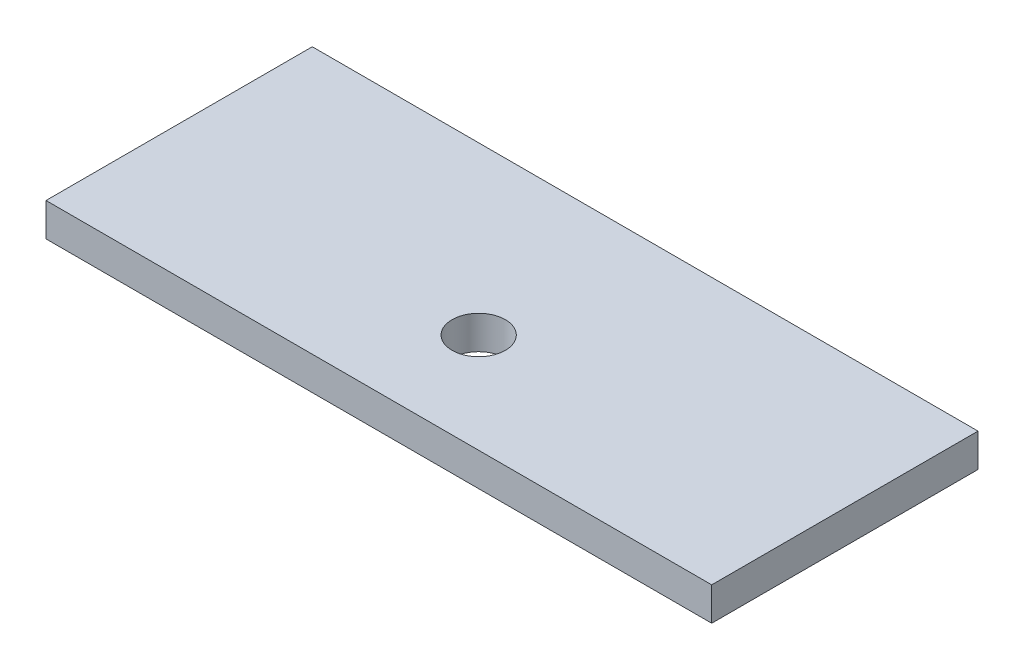
ISO-10303-21;
HEADER;
FILE_DESCRIPTION(('STEP AP214'),'2;1');
FILE_NAME('part.step','',(''),(''),'','','');
FILE_SCHEMA(('AUTOMOTIVE_DESIGN { 1 0 10303 214 1 1 1 1 }'));
ENDSEC;
DATA;
#1=APPLICATION_CONTEXT('core data for automotive mechanical design processes');
#2=APPLICATION_PROTOCOL_DEFINITION('international standard','automotive_design',2000,#1);
#3=PRODUCT_CONTEXT('',#1,'mechanical');
#4=PRODUCT('Part','Part','',(#3));
#5=PRODUCT_RELATED_PRODUCT_CATEGORY('part','',(#4));
#6=PRODUCT_DEFINITION_FORMATION('','',#4);
#7=PRODUCT_DEFINITION_CONTEXT('part definition',#1,'design');
#8=PRODUCT_DEFINITION('design','',#6,#7);
#9=PRODUCT_DEFINITION_SHAPE('','',#8);
#10=(LENGTH_UNIT() NAMED_UNIT(*) SI_UNIT(.MILLI.,.METRE.));
#11=(NAMED_UNIT(*) PLANE_ANGLE_UNIT() SI_UNIT($,.RADIAN.));
#12=(NAMED_UNIT(*) SI_UNIT($,.STERADIAN.) SOLID_ANGLE_UNIT());
#13=UNCERTAINTY_MEASURE_WITH_UNIT(LENGTH_MEASURE(1.E-05),#10,'distance_accuracy_value','');
#14=(GEOMETRIC_REPRESENTATION_CONTEXT(3) GLOBAL_UNCERTAINTY_ASSIGNED_CONTEXT((#13)) GLOBAL_UNIT_ASSIGNED_CONTEXT((#10,
#11,#12)) REPRESENTATION_CONTEXT('',''));
#15=CARTESIAN_POINT('',(0.,0.,0.));
#16=DIRECTION('',(0.,0.,1.));
#17=DIRECTION('',(1.,0.,0.));
#18=AXIS2_PLACEMENT_3D('',#15,#16,#17);
#19=CARTESIAN_POINT('',(-50.,5.,-20.));
#20=DIRECTION('',(1.,0.,0.));
#21=DIRECTION('',(0.,0.,-1.));
#22=AXIS2_PLACEMENT_3D('',#19,#20,#21);
#23=PLANE('',#22);
#24=DIRECTION('',(0.,0.,1.));
#25=VECTOR('',#24,1.);
#26=CARTESIAN_POINT('',(-50.,0.,-20.));
#27=LINE('',#26,#25);
#28=CARTESIAN_POINT('',(-50.,0.,-20.));
#29=VERTEX_POINT('',#28);
#30=CARTESIAN_POINT('',(-50.,0.,20.));
#31=VERTEX_POINT('',#30);
#32=EDGE_CURVE('E97',#29,#31,#27,.T.);
#33=ORIENTED_EDGE('',*,*,#32,.T.);
#34=DIRECTION('',(0.,-1.,0.));
#35=VECTOR('',#34,1.);
#36=CARTESIAN_POINT('',(-50.,5.,20.));
#37=LINE('',#36,#35);
#38=CARTESIAN_POINT('',(-50.,5.,20.));
#39=VERTEX_POINT('',#38);
#40=EDGE_CURVE('E11',#39,#31,#37,.T.);
#41=ORIENTED_EDGE('',*,*,#40,.F.);
#42=DIRECTION('',(0.,0.,1.));
#43=VECTOR('',#42,1.);
#44=CARTESIAN_POINT('',(-50.,5.,-20.));
#45=LINE('',#44,#43);
#46=CARTESIAN_POINT('',(-50.,5.,-20.));
#47=VERTEX_POINT('',#46);
#48=EDGE_CURVE('E85',#47,#39,#45,.T.);
#49=ORIENTED_EDGE('',*,*,#48,.F.);
#50=DIRECTION('',(0.,-1.,0.));
#51=VECTOR('',#50,1.);
#52=CARTESIAN_POINT('',(-50.,5.,-20.));
#53=LINE('',#52,#51);
#54=EDGE_CURVE('E93',#47,#29,#53,.T.);
#55=ORIENTED_EDGE('',*,*,#54,.T.);
#56=EDGE_LOOP('',(#33,#41,#49,#55));
#57=FACE_BOUND('',#56,.T.);
#58=ADVANCED_FACE('F34',(#57),#23,.F.);
#59=CARTESIAN_POINT('',(-50.,5.,20.));
#60=DIRECTION('',(0.,0.,-1.));
#61=DIRECTION('',(-1.,0.,0.));
#62=AXIS2_PLACEMENT_3D('',#59,#60,#61);
#63=PLANE('',#62);
#64=DIRECTION('',(1.,0.,0.));
#65=VECTOR('',#64,1.);
#66=CARTESIAN_POINT('',(-50.,0.,20.));
#67=LINE('',#66,#65);
#68=CARTESIAN_POINT('',(50.,0.,20.));
#69=VERTEX_POINT('',#68);
#70=EDGE_CURVE('E89',#31,#69,#67,.T.);
#71=ORIENTED_EDGE('',*,*,#70,.T.);
#72=DIRECTION('',(0.,-1.,0.));
#73=VECTOR('',#72,1.);
#74=CARTESIAN_POINT('',(50.,5.,20.));
#75=LINE('',#74,#73);
#76=CARTESIAN_POINT('',(50.,5.,20.));
#77=VERTEX_POINT('',#76);
#78=EDGE_CURVE('E42',#77,#69,#75,.T.);
#79=ORIENTED_EDGE('',*,*,#78,.F.);
#80=DIRECTION('',(1.,0.,0.));
#81=VECTOR('',#80,1.);
#82=CARTESIAN_POINT('',(-50.,5.,20.));
#83=LINE('',#82,#81);
#84=EDGE_CURVE('E80',#39,#77,#83,.T.);
#85=ORIENTED_EDGE('',*,*,#84,.F.);
#86=ORIENTED_EDGE('',*,*,#40,.T.);
#87=EDGE_LOOP('',(#71,#79,#85,#86));
#88=FACE_BOUND('',#87,.T.);
#89=ADVANCED_FACE('F88',(#88),#63,.F.);
#90=CARTESIAN_POINT('',(50.,5.,-20.));
#91=DIRECTION('',(-1.,0.,0.));
#92=DIRECTION('',(0.,0.,1.));
#93=AXIS2_PLACEMENT_3D('',#90,#91,#92);
#94=PLANE('',#93);
#95=DIRECTION('',(0.,0.,-1.));
#96=VECTOR('',#95,1.);
#97=CARTESIAN_POINT('',(50.,0.,-20.));
#98=LINE('',#97,#96);
#99=CARTESIAN_POINT('',(50.,0.,-20.));
#100=VERTEX_POINT('',#99);
#101=EDGE_CURVE('E67',#69,#100,#98,.T.);
#102=ORIENTED_EDGE('',*,*,#101,.T.);
#103=DIRECTION('',(0.,-1.,0.));
#104=VECTOR('',#103,1.);
#105=CARTESIAN_POINT('',(50.,5.,-20.));
#106=LINE('',#105,#104);
#107=CARTESIAN_POINT('',(50.,5.,-20.));
#108=VERTEX_POINT('',#107);
#109=EDGE_CURVE('E90',#108,#100,#106,.T.);
#110=ORIENTED_EDGE('',*,*,#109,.F.);
#111=DIRECTION('',(0.,0.,-1.));
#112=VECTOR('',#111,1.);
#113=CARTESIAN_POINT('',(50.,5.,-20.));
#114=LINE('',#113,#112);
#115=EDGE_CURVE('E83',#77,#108,#114,.T.);
#116=ORIENTED_EDGE('',*,*,#115,.F.);
#117=ORIENTED_EDGE('',*,*,#78,.T.);
#118=EDGE_LOOP('',(#102,#110,#116,#117));
#119=FACE_BOUND('',#118,.T.);
#120=ADVANCED_FACE('F91',(#119),#94,.F.);
#121=CARTESIAN_POINT('',(-50.,5.,-20.));
#122=DIRECTION('',(0.,0.,1.));
#123=DIRECTION('',(1.,0.,0.));
#124=AXIS2_PLACEMENT_3D('',#121,#122,#123);
#125=PLANE('',#124);
#126=DIRECTION('',(-1.,0.,0.));
#127=VECTOR('',#126,1.);
#128=CARTESIAN_POINT('',(-50.,0.,-20.));
#129=LINE('',#128,#127);
#130=EDGE_CURVE('E73',#100,#29,#129,.T.);
#131=ORIENTED_EDGE('',*,*,#130,.T.);
#132=ORIENTED_EDGE('',*,*,#54,.F.);
#133=DIRECTION('',(-1.,0.,0.));
#134=VECTOR('',#133,1.);
#135=CARTESIAN_POINT('',(-50.,5.,-20.));
#136=LINE('',#135,#134);
#137=EDGE_CURVE('E50',#108,#47,#136,.T.);
#138=ORIENTED_EDGE('',*,*,#137,.F.);
#139=ORIENTED_EDGE('',*,*,#109,.T.);
#140=EDGE_LOOP('',(#131,#132,#138,#139));
#141=FACE_BOUND('',#140,.T.);
#142=ADVANCED_FACE('F105',(#141),#125,.F.);
#143=CARTESIAN_POINT('',(-50.,5.,20.));
#144=DIRECTION('',(0.,1.,0.));
#145=DIRECTION('',(0.,0.,1.));
#146=AXIS2_PLACEMENT_3D('',#143,#144,#145);
#147=PLANE('',#146);
#148=CARTESIAN_POINT('',(0.,5.,5.));
#149=DIRECTION('',(0.,1.,0.));
#150=DIRECTION('',(0.,0.,1.));
#151=AXIS2_PLACEMENT_3D('',#148,#149,#150);
#152=CIRCLE('',#151,4.);
#153=CARTESIAN_POINT('',(0.,5.,9.00000000000001));
#154=VERTEX_POINT('',#153);
#155=EDGE_CURVE('E111',#154,#154,#152,.T.);
#156=ORIENTED_EDGE('',*,*,#155,.F.);
#157=EDGE_LOOP('',(#156));
#158=FACE_BOUND('',#157,.T.);
#159=ORIENTED_EDGE('',*,*,#48,.T.);
#160=ORIENTED_EDGE('',*,*,#84,.T.);
#161=ORIENTED_EDGE('',*,*,#115,.T.);
#162=ORIENTED_EDGE('',*,*,#137,.T.);
#163=EDGE_LOOP('',(#159,#160,#161,#162));
#164=FACE_BOUND('',#163,.T.);
#165=ADVANCED_FACE('F81',(#158,#164),#147,.T.);
#166=CARTESIAN_POINT('',(-50.,0.,20.));
#167=DIRECTION('',(0.,1.,0.));
#168=DIRECTION('',(0.,0.,1.));
#169=AXIS2_PLACEMENT_3D('',#166,#167,#168);
#170=PLANE('',#169);
#171=CARTESIAN_POINT('',(0.,0.,5.));
#172=DIRECTION('',(0.,1.,0.));
#173=DIRECTION('',(0.,0.,1.));
#174=AXIS2_PLACEMENT_3D('',#171,#172,#173);
#175=CIRCLE('',#174,4.);
#176=CARTESIAN_POINT('',(0.,0.,9.00000000000001));
#177=VERTEX_POINT('',#176);
#178=EDGE_CURVE('E100',#177,#177,#175,.T.);
#179=ORIENTED_EDGE('',*,*,#178,.T.);
#180=EDGE_LOOP('',(#179));
#181=FACE_BOUND('',#180,.T.);
#182=ORIENTED_EDGE('',*,*,#32,.F.);
#183=ORIENTED_EDGE('',*,*,#130,.F.);
#184=ORIENTED_EDGE('',*,*,#101,.F.);
#185=ORIENTED_EDGE('',*,*,#70,.F.);
#186=EDGE_LOOP('',(#182,#183,#184,#185));
#187=FACE_BOUND('',#186,.T.);
#188=ADVANCED_FACE('F108',(#181,#187),#170,.F.);
#189=CARTESIAN_POINT('',(0.,0.,5.));
#190=DIRECTION('',(0.,1.,0.));
#191=DIRECTION('',(0.,0.,1.));
#192=AXIS2_PLACEMENT_3D('',#189,#190,#191);
#193=CYLINDRICAL_SURFACE('',#192,4.);
#194=ORIENTED_EDGE('',*,*,#178,.F.);
#195=EDGE_LOOP('',(#194));
#196=FACE_BOUND('',#195,.T.);
#197=ORIENTED_EDGE('',*,*,#155,.T.);
#198=EDGE_LOOP('',(#197));
#199=FACE_BOUND('',#198,.T.);
#200=ADVANCED_FACE('F118',(#196,#199),#193,.F.);
#201=CLOSED_SHELL('',(#58,#89,#120,#142,#165,#188,#200));
#202=MANIFOLD_SOLID_BREP('B2',#201);
#203=ADVANCED_BREP_SHAPE_REPRESENTATION('',(#18,#202),#14);
#204=SHAPE_DEFINITION_REPRESENTATION(#9,#203);
ENDSEC;
END-ISO-10303-21;
